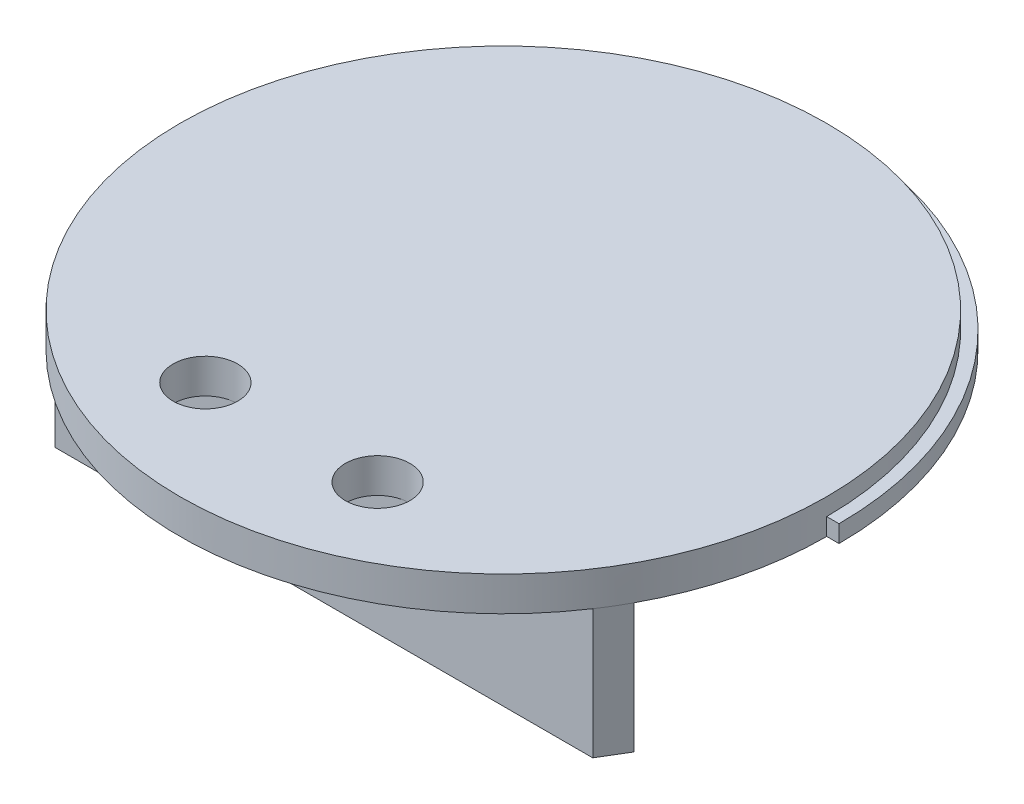
ISO-10303-21;
HEADER;
FILE_DESCRIPTION(('STEP AP214'),'2;1');
FILE_NAME('part.step','',(''),(''),'','','');
FILE_SCHEMA(('AUTOMOTIVE_DESIGN { 1 0 10303 214 1 1 1 1 }'));
ENDSEC;
DATA;
#1=APPLICATION_CONTEXT('core data for automotive mechanical design processes');
#2=APPLICATION_PROTOCOL_DEFINITION('international standard','automotive_design',2000,#1);
#3=PRODUCT_CONTEXT('',#1,'mechanical');
#4=PRODUCT('Part','Part','',(#3));
#5=PRODUCT_RELATED_PRODUCT_CATEGORY('part','',(#4));
#6=PRODUCT_DEFINITION_FORMATION('','',#4);
#7=PRODUCT_DEFINITION_CONTEXT('part definition',#1,'design');
#8=PRODUCT_DEFINITION('design','',#6,#7);
#9=PRODUCT_DEFINITION_SHAPE('','',#8);
#10=(LENGTH_UNIT() NAMED_UNIT(*) SI_UNIT(.MILLI.,.METRE.));
#11=(NAMED_UNIT(*) PLANE_ANGLE_UNIT() SI_UNIT($,.RADIAN.));
#12=(NAMED_UNIT(*) SI_UNIT($,.STERADIAN.) SOLID_ANGLE_UNIT());
#13=UNCERTAINTY_MEASURE_WITH_UNIT(LENGTH_MEASURE(1.E-05),#10,'distance_accuracy_value','');
#14=(GEOMETRIC_REPRESENTATION_CONTEXT(3) GLOBAL_UNCERTAINTY_ASSIGNED_CONTEXT((#13)) GLOBAL_UNIT_ASSIGNED_CONTEXT((#10,
#11,#12)) REPRESENTATION_CONTEXT('',''));
#15=CARTESIAN_POINT('',(0.,0.,0.));
#16=DIRECTION('',(0.,0.,1.));
#17=DIRECTION('',(1.,0.,0.));
#18=AXIS2_PLACEMENT_3D('',#15,#16,#17);
#19=CARTESIAN_POINT('',(0.,0.,0.));
#20=DIRECTION('',(0.,1.,0.));
#21=DIRECTION('',(0.,0.,1.));
#22=AXIS2_PLACEMENT_3D('',#19,#20,#21);
#23=PLANE('',#22);
#24=DIRECTION('',(-0.51573442439247,0.,0.856748506562205));
#25=VECTOR('',#24,1.);
#26=CARTESIAN_POINT('',(39.665868398049,0.,26.4728524431852));
#27=LINE('',#26,#25);
#28=CARTESIAN_POINT('',(41.9593630956001,0.,22.6628524431852));
#29=VERTEX_POINT('',#28);
#30=CARTESIAN_POINT('',(39.665868398049,0.,26.4728524431852));
#31=VERTEX_POINT('',#30);
#32=EDGE_CURVE('E52',#29,#31,#27,.T.);
#33=ORIENTED_EDGE('',*,*,#32,.F.);
#34=CARTESIAN_POINT('',(0.,0.,0.));
#35=DIRECTION('',(0.,1.,0.));
#36=DIRECTION('',(0.,0.,1.));
#37=AXIS2_PLACEMENT_3D('',#34,#35,#36);
#38=CIRCLE('',#37,47.6885);
#39=EDGE_CURVE('E368',#31,#29,#38,.T.);
#40=ORIENTED_EDGE('',*,*,#39,.F.);
#41=EDGE_LOOP('',(#33,#40));
#42=FACE_BOUND('',#41,.T.);
#43=ADVANCED_FACE('F35',(#42),#23,.F.);
#44=DIRECTION('',(1.,0.,0.));
#45=VECTOR('',#44,1.);
#46=CARTESIAN_POINT('',(41.9593630956001,0.,22.6628524431852));
#47=LINE('',#46,#45);
#48=CARTESIAN_POINT('',(-41.9593630956001,0.,22.6628524431853));
#49=VERTEX_POINT('',#48);
#50=EDGE_CURVE('E130',#49,#29,#47,.T.);
#51=ORIENTED_EDGE('',*,*,#50,.F.);
#52=CARTESIAN_POINT('',(-47.6885,0.,0.));
#53=VERTEX_POINT('',#52);
#54=EDGE_CURVE('E171',#53,#49,#38,.T.);
#55=ORIENTED_EDGE('',*,*,#54,.F.);
#56=DIRECTION('',(1.,0.,0.));
#57=VECTOR('',#56,1.);
#58=CARTESIAN_POINT('',(-49.5046,0.,0.));
#59=LINE('',#58,#57);
#60=CARTESIAN_POINT('',(-49.5046,0.,0.));
#61=VERTEX_POINT('',#60);
#62=EDGE_CURVE('E168',#61,#53,#59,.T.);
#63=ORIENTED_EDGE('',*,*,#62,.F.);
#64=CARTESIAN_POINT('',(0.,0.,0.));
#65=DIRECTION('',(0.,1.,0.));
#66=DIRECTION('',(0.,0.,1.));
#67=AXIS2_PLACEMENT_3D('',#64,#65,#66);
#68=CIRCLE('',#67,49.5046);
#69=CARTESIAN_POINT('',(49.5046,0.,0.));
#70=VERTEX_POINT('',#69);
#71=EDGE_CURVE('E154',#70,#61,#68,.T.);
#72=ORIENTED_EDGE('',*,*,#71,.F.);
#73=DIRECTION('',(1.,0.,0.));
#74=VECTOR('',#73,1.);
#75=CARTESIAN_POINT('',(49.5046,0.,0.));
#76=LINE('',#75,#74);
#77=CARTESIAN_POINT('',(47.6885,0.,0.));
#78=VERTEX_POINT('',#77);
#79=EDGE_CURVE('E161',#78,#70,#76,.T.);
#80=ORIENTED_EDGE('',*,*,#79,.F.);
#81=EDGE_CURVE('E170',#29,#78,#38,.T.);
#82=ORIENTED_EDGE('',*,*,#81,.F.);
#83=EDGE_LOOP('',(#51,#55,#63,#72,#80,#82));
#84=FACE_BOUND('',#83,.T.);
#85=ADVANCED_FACE('F207',(#84),#23,.F.);
#86=DIRECTION('',(-0.51573442439247,0.,-0.856748506562205));
#87=VECTOR('',#86,1.);
#88=CARTESIAN_POINT('',(-39.665868398049,0.,26.4728524431852));
#89=LINE('',#88,#87);
#90=CARTESIAN_POINT('',(-39.665868398049,0.,26.4728524431852));
#91=VERTEX_POINT('',#90);
#92=EDGE_CURVE('E190',#91,#49,#89,.T.);
#93=ORIENTED_EDGE('',*,*,#92,.F.);
#94=EDGE_CURVE('E174',#49,#91,#38,.T.);
#95=ORIENTED_EDGE('',*,*,#94,.F.);
#96=EDGE_LOOP('',(#93,#95));
#97=FACE_BOUND('',#96,.T.);
#98=ADVANCED_FACE('F211',(#97),#23,.F.);
#99=DIRECTION('',(-1.,0.,0.));
#100=VECTOR('',#99,1.);
#101=CARTESIAN_POINT('',(39.665868398049,0.,26.4728524431852));
#102=LINE('',#101,#100);
#103=CARTESIAN_POINT('',(12.7,0.,26.4728524431852));
#104=VERTEX_POINT('',#103);
#105=EDGE_CURVE('E46',#31,#104,#102,.T.);
#106=ORIENTED_EDGE('',*,*,#105,.F.);
#107=EDGE_CURVE('E213',#91,#31,#38,.T.);
#108=ORIENTED_EDGE('',*,*,#107,.F.);
#109=CARTESIAN_POINT('',(-12.7,0.,26.4728524431852));
#110=VERTEX_POINT('',#109);
#111=EDGE_CURVE('E44',#110,#91,#102,.T.);
#112=ORIENTED_EDGE('',*,*,#111,.F.);
#113=CARTESIAN_POINT('',(-12.7,0.,31.2353524431853));
#114=DIRECTION('',(0.,-1.,0.));
#115=DIRECTION('',(0.,0.,-1.));
#116=AXIS2_PLACEMENT_3D('',#113,#114,#115);
#117=CIRCLE('',#116,4.7625);
#118=EDGE_CURVE('E133',#110,#110,#117,.T.);
#119=ORIENTED_EDGE('',*,*,#118,.F.);
#120=EDGE_CURVE('E11',#104,#110,#102,.T.);
#121=ORIENTED_EDGE('',*,*,#120,.F.);
#122=CARTESIAN_POINT('',(12.7,0.,31.2353524431853));
#123=DIRECTION('',(0.,-1.,0.));
#124=DIRECTION('',(0.,0.,-1.));
#125=AXIS2_PLACEMENT_3D('',#122,#123,#124);
#126=CIRCLE('',#125,4.7625);
#127=EDGE_CURVE('E146',#104,#104,#126,.T.);
#128=ORIENTED_EDGE('',*,*,#127,.F.);
#129=EDGE_LOOP('',(#106,#108,#112,#119,#121,#128));
#130=FACE_BOUND('',#129,.T.);
#131=ADVANCED_FACE('F240',(#130),#23,.F.);
#132=CARTESIAN_POINT('',(0.,2.54,0.));
#133=DIRECTION('',(0.,-1.,0.));
#134=DIRECTION('',(0.,0.,-1.));
#135=AXIS2_PLACEMENT_3D('',#132,#133,#134);
#136=CYLINDRICAL_SURFACE('',#135,49.5046);
#137=ORIENTED_EDGE('',*,*,#71,.T.);
#138=DIRECTION('',(0.,-1.,0.));
#139=VECTOR('',#138,1.);
#140=CARTESIAN_POINT('',(-49.5046,2.54,0.));
#141=LINE('',#140,#139);
#142=CARTESIAN_POINT('',(-49.5046,2.54,0.));
#143=VERTEX_POINT('',#142);
#144=EDGE_CURVE('E39',#143,#61,#141,.T.);
#145=ORIENTED_EDGE('',*,*,#144,.F.);
#146=CARTESIAN_POINT('',(0.,2.54,0.));
#147=DIRECTION('',(0.,1.,0.));
#148=DIRECTION('',(0.,0.,1.));
#149=AXIS2_PLACEMENT_3D('',#146,#147,#148);
#150=CIRCLE('',#149,49.5046);
#151=CARTESIAN_POINT('',(49.5046,2.54,0.));
#152=VERTEX_POINT('',#151);
#153=EDGE_CURVE('E157',#152,#143,#150,.T.);
#154=ORIENTED_EDGE('',*,*,#153,.F.);
#155=DIRECTION('',(0.,-1.,0.));
#156=VECTOR('',#155,1.);
#157=CARTESIAN_POINT('',(49.5046,2.54,0.));
#158=LINE('',#157,#156);
#159=EDGE_CURVE('E165',#152,#70,#158,.T.);
#160=ORIENTED_EDGE('',*,*,#159,.T.);
#161=EDGE_LOOP('',(#137,#145,#154,#160));
#162=FACE_BOUND('',#161,.T.);
#163=ADVANCED_FACE('F37',(#162),#136,.T.);
#164=CARTESIAN_POINT('',(-49.5046,2.54,0.));
#165=DIRECTION('',(0.,0.,-1.));
#166=DIRECTION('',(-1.,0.,0.));
#167=AXIS2_PLACEMENT_3D('',#164,#165,#166);
#168=PLANE('',#167);
#169=ORIENTED_EDGE('',*,*,#62,.T.);
#170=DIRECTION('',(0.,-1.,0.));
#171=VECTOR('',#170,1.);
#172=CARTESIAN_POINT('',(-47.6885,2.54,0.));
#173=LINE('',#172,#171);
#174=CARTESIAN_POINT('',(-47.6885,2.54,0.));
#175=VERTEX_POINT('',#174);
#176=EDGE_CURVE('E180',#175,#53,#173,.T.);
#177=ORIENTED_EDGE('',*,*,#176,.F.);
#178=DIRECTION('',(1.,0.,0.));
#179=VECTOR('',#178,1.);
#180=CARTESIAN_POINT('',(-49.5046,2.54,0.));
#181=LINE('',#180,#179);
#182=EDGE_CURVE('E160',#143,#175,#181,.T.);
#183=ORIENTED_EDGE('',*,*,#182,.F.);
#184=ORIENTED_EDGE('',*,*,#144,.T.);
#185=EDGE_LOOP('',(#169,#177,#183,#184));
#186=FACE_BOUND('',#185,.T.);
#187=ADVANCED_FACE('F218',(#186),#168,.F.);
#188=CARTESIAN_POINT('',(0.,2.54,0.));
#189=DIRECTION('',(0.,-1.,0.));
#190=DIRECTION('',(0.,0.,-1.));
#191=AXIS2_PLACEMENT_3D('',#188,#189,#190);
#192=CYLINDRICAL_SURFACE('',#191,47.6885);
#193=ORIENTED_EDGE('',*,*,#54,.T.);
#194=ORIENTED_EDGE('',*,*,#94,.T.);
#195=ORIENTED_EDGE('',*,*,#107,.T.);
#196=ORIENTED_EDGE('',*,*,#39,.T.);
#197=ORIENTED_EDGE('',*,*,#81,.T.);
#198=DIRECTION('',(0.,-1.,0.));
#199=VECTOR('',#198,1.);
#200=CARTESIAN_POINT('',(47.6885,2.54,0.));
#201=LINE('',#200,#199);
#202=CARTESIAN_POINT('',(47.6885,2.54,0.));
#203=VERTEX_POINT('',#202);
#204=EDGE_CURVE('E178',#203,#78,#201,.T.);
#205=ORIENTED_EDGE('',*,*,#204,.F.);
#206=CARTESIAN_POINT('',(0.,2.54,0.));
#207=DIRECTION('',(0.,1.,0.));
#208=DIRECTION('',(0.,0.,1.));
#209=AXIS2_PLACEMENT_3D('',#206,#207,#208);
#210=CIRCLE('',#209,47.6885);
#211=EDGE_CURVE('E145',#203,#175,#210,.T.);
#212=ORIENTED_EDGE('',*,*,#211,.T.);
#213=ORIENTED_EDGE('',*,*,#176,.T.);
#214=EDGE_LOOP('',(#193,#194,#195,#196,#197,#205,#212,#213));
#215=FACE_BOUND('',#214,.T.);
#216=CARTESIAN_POINT('',(0.,5.08,0.));
#217=DIRECTION('',(0.,1.,0.));
#218=DIRECTION('',(0.,0.,1.));
#219=AXIS2_PLACEMENT_3D('',#216,#217,#218);
#220=CIRCLE('',#219,47.6885);
#221=CARTESIAN_POINT('',(0.,5.08,47.6885));
#222=VERTEX_POINT('',#221);
#223=EDGE_CURVE('E151',#222,#222,#220,.T.);
#224=ORIENTED_EDGE('',*,*,#223,.F.);
#225=EDGE_LOOP('',(#224));
#226=FACE_BOUND('',#225,.T.);
#227=ADVANCED_FACE('F214',(#215,#226),#192,.T.);
#228=CARTESIAN_POINT('',(49.5046,2.54,0.));
#229=DIRECTION('',(0.,0.,-1.));
#230=DIRECTION('',(-1.,0.,0.));
#231=AXIS2_PLACEMENT_3D('',#228,#229,#230);
#232=PLANE('',#231);
#233=ORIENTED_EDGE('',*,*,#79,.T.);
#234=ORIENTED_EDGE('',*,*,#159,.F.);
#235=DIRECTION('',(1.,0.,0.));
#236=VECTOR('',#235,1.);
#237=CARTESIAN_POINT('',(49.5046,2.54,0.));
#238=LINE('',#237,#236);
#239=EDGE_CURVE('E163',#203,#152,#238,.T.);
#240=ORIENTED_EDGE('',*,*,#239,.F.);
#241=ORIENTED_EDGE('',*,*,#204,.T.);
#242=EDGE_LOOP('',(#233,#234,#240,#241));
#243=FACE_BOUND('',#242,.T.);
#244=ADVANCED_FACE('F217',(#243),#232,.F.);
#245=CARTESIAN_POINT('',(0.,2.54,0.));
#246=DIRECTION('',(0.,1.,0.));
#247=DIRECTION('',(0.,0.,1.));
#248=AXIS2_PLACEMENT_3D('',#245,#246,#247);
#249=PLANE('',#248);
#250=ORIENTED_EDGE('',*,*,#211,.F.);
#251=ORIENTED_EDGE('',*,*,#239,.T.);
#252=ORIENTED_EDGE('',*,*,#153,.T.);
#253=ORIENTED_EDGE('',*,*,#182,.T.);
#254=EDGE_LOOP('',(#250,#251,#252,#253));
#255=FACE_BOUND('',#254,.T.);
#256=ADVANCED_FACE('F225',(#255),#249,.T.);
#257=CARTESIAN_POINT('',(0.,5.08,0.));
#258=DIRECTION('',(0.,1.,0.));
#259=DIRECTION('',(0.,0.,1.));
#260=AXIS2_PLACEMENT_3D('',#257,#258,#259);
#261=PLANE('',#260);
#262=CARTESIAN_POINT('',(12.7,5.08,31.2353524431853));
#263=DIRECTION('',(0.,-1.,0.));
#264=DIRECTION('',(0.,0.,-1.));
#265=AXIS2_PLACEMENT_3D('',#262,#263,#264);
#266=CIRCLE('',#265,4.7625);
#267=CARTESIAN_POINT('',(12.7,5.08,26.4728524431853));
#268=VERTEX_POINT('',#267);
#269=EDGE_CURVE('E142',#268,#268,#266,.T.);
#270=ORIENTED_EDGE('',*,*,#269,.T.);
#271=EDGE_LOOP('',(#270));
#272=FACE_BOUND('',#271,.T.);
#273=CARTESIAN_POINT('',(-12.7,5.08,31.2353524431853));
#274=DIRECTION('',(0.,-1.,0.));
#275=DIRECTION('',(0.,0.,-1.));
#276=AXIS2_PLACEMENT_3D('',#273,#274,#275);
#277=CIRCLE('',#276,4.7625);
#278=CARTESIAN_POINT('',(-12.7,5.08,26.4728524431853));
#279=VERTEX_POINT('',#278);
#280=EDGE_CURVE('E136',#279,#279,#277,.T.);
#281=ORIENTED_EDGE('',*,*,#280,.T.);
#282=EDGE_LOOP('',(#281));
#283=FACE_BOUND('',#282,.T.);
#284=ORIENTED_EDGE('',*,*,#223,.T.);
#285=EDGE_LOOP('',(#284));
#286=FACE_BOUND('',#285,.T.);
#287=ADVANCED_FACE('F222',(#272,#283,#286),#261,.T.);
#288=CARTESIAN_POINT('',(-12.7,5.08,31.2353524431853));
#289=DIRECTION('',(0.,-1.,0.));
#290=DIRECTION('',(0.,0.,-1.));
#291=AXIS2_PLACEMENT_3D('',#288,#289,#290);
#292=CYLINDRICAL_SURFACE('',#291,4.7625);
#293=ORIENTED_EDGE('',*,*,#280,.F.);
#294=EDGE_LOOP('',(#293));
#295=FACE_BOUND('',#294,.T.);
#296=ORIENTED_EDGE('',*,*,#118,.T.);
#297=EDGE_LOOP('',(#296));
#298=FACE_BOUND('',#297,.T.);
#299=ADVANCED_FACE('F224',(#295,#298),#292,.F.);
#300=CARTESIAN_POINT('',(12.7,5.08,31.2353524431853));
#301=DIRECTION('',(0.,-1.,0.));
#302=DIRECTION('',(0.,0.,-1.));
#303=AXIS2_PLACEMENT_3D('',#300,#301,#302);
#304=CYLINDRICAL_SURFACE('',#303,4.7625);
#305=ORIENTED_EDGE('',*,*,#269,.F.);
#306=EDGE_LOOP('',(#305));
#307=FACE_BOUND('',#306,.T.);
#308=ORIENTED_EDGE('',*,*,#127,.T.);
#309=EDGE_LOOP('',(#308));
#310=FACE_BOUND('',#309,.T.);
#311=ADVANCED_FACE('F232',(#307,#310),#304,.F.);
#312=CARTESIAN_POINT('',(39.665868398049,-19.05,26.4728524431852));
#313=DIRECTION('',(-0.856748506562204,0.,-0.51573442439247));
#314=DIRECTION('',(-0.51573442439247,0.,0.856748506562204));
#315=AXIS2_PLACEMENT_3D('',#312,#313,#314);
#316=PLANE('',#315);
#317=ORIENTED_EDGE('',*,*,#32,.T.);
#318=DIRECTION('',(0.,1.,0.));
#319=VECTOR('',#318,1.);
#320=CARTESIAN_POINT('',(39.665868398049,-19.05,26.4728524431852));
#321=LINE('',#320,#319);
#322=CARTESIAN_POINT('',(39.665868398049,-19.05,26.4728524431852));
#323=VERTEX_POINT('',#322);
#324=EDGE_CURVE('E114',#323,#31,#321,.T.);
#325=ORIENTED_EDGE('',*,*,#324,.F.);
#326=DIRECTION('',(-0.51573442439247,0.,0.856748506562205));
#327=VECTOR('',#326,1.);
#328=CARTESIAN_POINT('',(39.665868398049,-19.05,26.4728524431852));
#329=LINE('',#328,#327);
#330=CARTESIAN_POINT('',(41.9593630956001,-19.05,22.6628524431852));
#331=VERTEX_POINT('',#330);
#332=EDGE_CURVE('E121',#331,#323,#329,.T.);
#333=ORIENTED_EDGE('',*,*,#332,.F.);
#334=DIRECTION('',(0.,1.,0.));
#335=VECTOR('',#334,1.);
#336=CARTESIAN_POINT('',(41.9593630956001,-19.05,22.6628524431852));
#337=LINE('',#336,#335);
#338=EDGE_CURVE('E194',#331,#29,#337,.T.);
#339=ORIENTED_EDGE('',*,*,#338,.T.);
#340=EDGE_LOOP('',(#317,#325,#333,#339));
#341=FACE_BOUND('',#340,.T.);
#342=ADVANCED_FACE('F132',(#341),#316,.F.);
#343=CARTESIAN_POINT('',(39.665868398049,-19.05,26.4728524431852));
#344=DIRECTION('',(0.,0.,-1.));
#345=DIRECTION('',(-1.,0.,0.));
#346=AXIS2_PLACEMENT_3D('',#343,#344,#345);
#347=PLANE('',#346);
#348=ORIENTED_EDGE('',*,*,#105,.T.);
#349=ORIENTED_EDGE('',*,*,#120,.T.);
#350=ORIENTED_EDGE('',*,*,#111,.T.);
#351=DIRECTION('',(0.,1.,0.));
#352=VECTOR('',#351,1.);
#353=CARTESIAN_POINT('',(-39.665868398049,-19.05,26.4728524431852));
#354=LINE('',#353,#352);
#355=CARTESIAN_POINT('',(-39.665868398049,-19.05,26.4728524431852));
#356=VERTEX_POINT('',#355);
#357=EDGE_CURVE('E117',#356,#91,#354,.T.);
#358=ORIENTED_EDGE('',*,*,#357,.F.);
#359=DIRECTION('',(-1.,0.,0.));
#360=VECTOR('',#359,1.);
#361=CARTESIAN_POINT('',(39.665868398049,-19.05,26.4728524431852));
#362=LINE('',#361,#360);
#363=EDGE_CURVE('E110',#323,#356,#362,.T.);
#364=ORIENTED_EDGE('',*,*,#363,.F.);
#365=ORIENTED_EDGE('',*,*,#324,.T.);
#366=EDGE_LOOP('',(#348,#349,#350,#358,#364,#365));
#367=FACE_BOUND('',#366,.T.);
#368=ADVANCED_FACE('F112',(#367),#347,.F.);
#369=CARTESIAN_POINT('',(-39.665868398049,-19.05,26.4728524431852));
#370=DIRECTION('',(0.856748506562204,0.,-0.51573442439247));
#371=DIRECTION('',(-0.51573442439247,0.,-0.856748506562204));
#372=AXIS2_PLACEMENT_3D('',#369,#370,#371);
#373=PLANE('',#372);
#374=ORIENTED_EDGE('',*,*,#92,.T.);
#375=DIRECTION('',(0.,1.,0.));
#376=VECTOR('',#375,1.);
#377=CARTESIAN_POINT('',(-41.9593630956001,-19.05,22.6628524431852));
#378=LINE('',#377,#376);
#379=CARTESIAN_POINT('',(-41.9593630956001,-19.05,22.6628524431852));
#380=VERTEX_POINT('',#379);
#381=EDGE_CURVE('E138',#380,#49,#378,.T.);
#382=ORIENTED_EDGE('',*,*,#381,.F.);
#383=DIRECTION('',(-0.51573442439247,0.,-0.856748506562205));
#384=VECTOR('',#383,1.);
#385=CARTESIAN_POINT('',(-39.665868398049,-19.05,26.4728524431852));
#386=LINE('',#385,#384);
#387=EDGE_CURVE('E120',#356,#380,#386,.T.);
#388=ORIENTED_EDGE('',*,*,#387,.F.);
#389=ORIENTED_EDGE('',*,*,#357,.T.);
#390=EDGE_LOOP('',(#374,#382,#388,#389));
#391=FACE_BOUND('',#390,.T.);
#392=ADVANCED_FACE('F198',(#391),#373,.F.);
#393=CARTESIAN_POINT('',(41.9593630956001,-19.05,22.6628524431852));
#394=DIRECTION('',(0.,0.,1.));
#395=DIRECTION('',(1.,0.,0.));
#396=AXIS2_PLACEMENT_3D('',#393,#394,#395);
#397=PLANE('',#396);
#398=ORIENTED_EDGE('',*,*,#50,.T.);
#399=ORIENTED_EDGE('',*,*,#338,.F.);
#400=DIRECTION('',(1.,0.,0.));
#401=VECTOR('',#400,1.);
#402=CARTESIAN_POINT('',(41.9593630956001,-19.05,22.6628524431852));
#403=LINE('',#402,#401);
#404=EDGE_CURVE('E126',#380,#331,#403,.T.);
#405=ORIENTED_EDGE('',*,*,#404,.F.);
#406=ORIENTED_EDGE('',*,*,#381,.T.);
#407=EDGE_LOOP('',(#398,#399,#405,#406));
#408=FACE_BOUND('',#407,.T.);
#409=ADVANCED_FACE('F202',(#408),#397,.F.);
#410=CARTESIAN_POINT('',(0.,-19.05,0.));
#411=DIRECTION('',(0.,1.,0.));
#412=DIRECTION('',(0.,0.,1.));
#413=AXIS2_PLACEMENT_3D('',#410,#411,#412);
#414=PLANE('',#413);
#415=ORIENTED_EDGE('',*,*,#332,.T.);
#416=ORIENTED_EDGE('',*,*,#363,.T.);
#417=ORIENTED_EDGE('',*,*,#387,.T.);
#418=ORIENTED_EDGE('',*,*,#404,.T.);
#419=EDGE_LOOP('',(#415,#416,#417,#418));
#420=FACE_BOUND('',#419,.T.);
#421=ADVANCED_FACE('F124',(#420),#414,.F.);
#422=CLOSED_SHELL('',(#43,#85,#98,#131,#163,#187,#227,#244,#256,#287,#299,#311,#342,#368,#392,
#409,#421));
#423=MANIFOLD_SOLID_BREP('B2',#422);
#424=ADVANCED_BREP_SHAPE_REPRESENTATION('',(#18,#423),#14);
#425=SHAPE_DEFINITION_REPRESENTATION(#9,#424);
ENDSEC;
END-ISO-10303-21;
